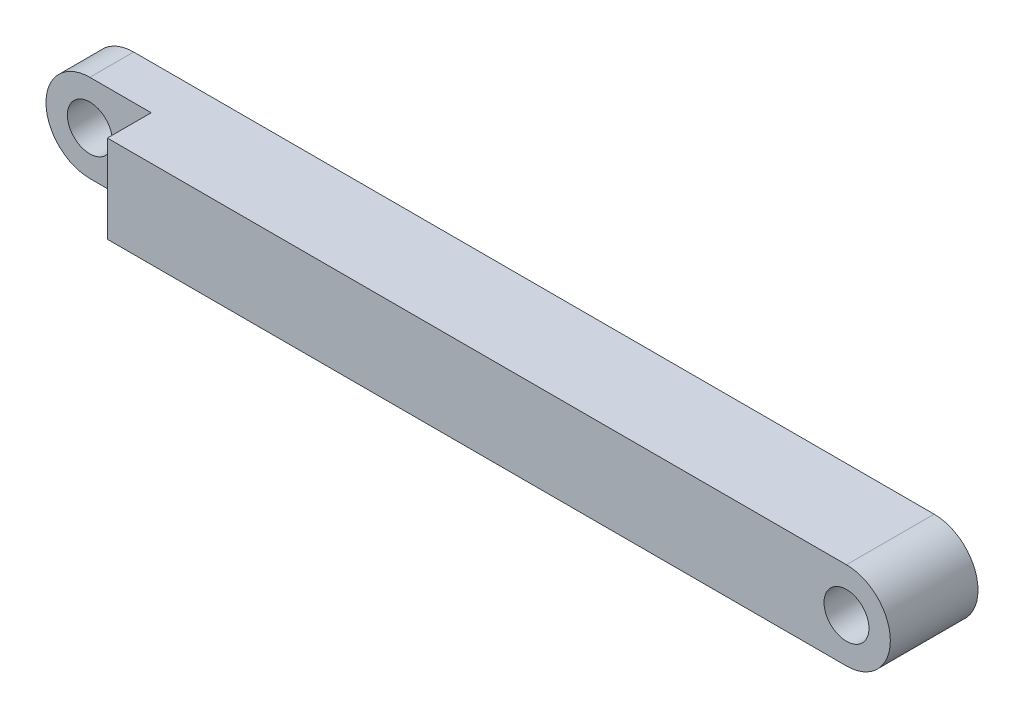
ISO-10303-21;
HEADER;
FILE_DESCRIPTION(('STEP AP214'),'2;1');
FILE_NAME('part.step','',(''),(''),'','','');
FILE_SCHEMA(('AUTOMOTIVE_DESIGN { 1 0 10303 214 1 1 1 1 }'));
ENDSEC;
DATA;
#1=APPLICATION_CONTEXT('core data for automotive mechanical design processes');
#2=APPLICATION_PROTOCOL_DEFINITION('international standard','automotive_design',2000,#1);
#3=PRODUCT_CONTEXT('',#1,'mechanical');
#4=PRODUCT('Part','Part','',(#3));
#5=PRODUCT_RELATED_PRODUCT_CATEGORY('part','',(#4));
#6=PRODUCT_DEFINITION_FORMATION('','',#4);
#7=PRODUCT_DEFINITION_CONTEXT('part definition',#1,'design');
#8=PRODUCT_DEFINITION('design','',#6,#7);
#9=PRODUCT_DEFINITION_SHAPE('','',#8);
#10=(LENGTH_UNIT() NAMED_UNIT(*) SI_UNIT(.MILLI.,.METRE.));
#11=(NAMED_UNIT(*) PLANE_ANGLE_UNIT() SI_UNIT($,.RADIAN.));
#12=(NAMED_UNIT(*) SI_UNIT($,.STERADIAN.) SOLID_ANGLE_UNIT());
#13=UNCERTAINTY_MEASURE_WITH_UNIT(LENGTH_MEASURE(1.E-05),#10,'distance_accuracy_value','');
#14=(GEOMETRIC_REPRESENTATION_CONTEXT(3) GLOBAL_UNCERTAINTY_ASSIGNED_CONTEXT((#13)) GLOBAL_UNIT_ASSIGNED_CONTEXT((#10,
#11,#12)) REPRESENTATION_CONTEXT('',''));
#15=CARTESIAN_POINT('',(0.,0.,0.));
#16=DIRECTION('',(0.,0.,1.));
#17=DIRECTION('',(1.,0.,0.));
#18=AXIS2_PLACEMENT_3D('',#15,#16,#17);
#19=CARTESIAN_POINT('',(-3.175,0.,6.35));
#20=DIRECTION('',(0.,0.,1.));
#21=DIRECTION('',(1.,0.,0.));
#22=AXIS2_PLACEMENT_3D('',#19,#20,#21);
#23=PLANE('',#22);
#24=DIRECTION('',(0.,1.,0.));
#25=VECTOR('',#24,1.);
#26=CARTESIAN_POINT('',(-56.706306570156,3.175,6.35));
#27=LINE('',#26,#25);
#28=CARTESIAN_POINT('',(-56.706306570156,-3.17500000000002,6.35));
#29=VERTEX_POINT('',#28);
#30=CARTESIAN_POINT('',(-56.706306570156,3.175,6.35));
#31=VERTEX_POINT('',#30);
#32=EDGE_CURVE('E143',#29,#31,#27,.T.);
#33=ORIENTED_EDGE('',*,*,#32,.F.);
#34=DIRECTION('',(1.,0.,0.));
#35=VECTOR('',#34,1.);
#36=CARTESIAN_POINT('',(-35.4566020445434,-3.175,6.35));
#37=LINE('',#36,#35);
#38=CARTESIAN_POINT('',(-3.175,-3.175,6.35));
#39=VERTEX_POINT('',#38);
#40=EDGE_CURVE('E109',#29,#39,#37,.T.);
#41=ORIENTED_EDGE('',*,*,#40,.T.);
#42=CARTESIAN_POINT('',(-3.175,0.,6.35));
#43=DIRECTION('',(0.,0.,1.));
#44=DIRECTION('',(1.,0.,0.));
#45=AXIS2_PLACEMENT_3D('',#42,#43,#44);
#46=CIRCLE('',#45,3.175);
#47=CARTESIAN_POINT('',(-3.175,3.175,6.35));
#48=VERTEX_POINT('',#47);
#49=EDGE_CURVE('E64',#39,#48,#46,.T.);
#50=ORIENTED_EDGE('',*,*,#49,.T.);
#51=DIRECTION('',(-1.,0.,0.));
#52=VECTOR('',#51,1.);
#53=CARTESIAN_POINT('',(-61.1513065701559,3.175,6.35));
#54=LINE('',#53,#52);
#55=EDGE_CURVE('E94',#48,#31,#54,.T.);
#56=ORIENTED_EDGE('',*,*,#55,.T.);
#57=EDGE_LOOP('',(#33,#41,#50,#56));
#58=FACE_BOUND('',#57,.T.);
#59=CARTESIAN_POINT('',(-3.175,0.,6.35));
#60=DIRECTION('',(0.,0.,1.));
#61=DIRECTION('',(1.,0.,0.));
#62=AXIS2_PLACEMENT_3D('',#59,#60,#61);
#63=CIRCLE('',#62,1.627);
#64=CARTESIAN_POINT('',(-1.548,0.,6.35));
#65=VERTEX_POINT('',#64);
#66=EDGE_CURVE('E123',#65,#65,#63,.T.);
#67=ORIENTED_EDGE('',*,*,#66,.F.);
#68=EDGE_LOOP('',(#67));
#69=FACE_BOUND('',#68,.T.);
#70=ADVANCED_FACE('F39',(#58,#69),#23,.T.);
#71=CARTESIAN_POINT('',(-3.175,0.,0.));
#72=DIRECTION('',(0.,0.,1.));
#73=DIRECTION('',(1.,0.,0.));
#74=AXIS2_PLACEMENT_3D('',#71,#72,#73);
#75=PLANE('',#74);
#76=CARTESIAN_POINT('',(-61.151306570156,0.,0.));
#77=DIRECTION('',(0.,0.,1.));
#78=DIRECTION('',(1.,0.,0.));
#79=AXIS2_PLACEMENT_3D('',#76,#77,#78);
#80=CIRCLE('',#79,3.17499999999994);
#81=CARTESIAN_POINT('',(-61.1513065701559,3.17499999999994,0.));
#82=VERTEX_POINT('',#81);
#83=CARTESIAN_POINT('',(-61.1513065701559,-3.175,0.));
#84=VERTEX_POINT('',#83);
#85=EDGE_CURVE('E90',#82,#84,#80,.T.);
#86=ORIENTED_EDGE('',*,*,#85,.F.);
#87=DIRECTION('',(-1.,0.,0.));
#88=VECTOR('',#87,1.);
#89=CARTESIAN_POINT('',(-35.4566020445434,3.175,0.));
#90=LINE('',#89,#88);
#91=CARTESIAN_POINT('',(-3.175,3.175,0.));
#92=VERTEX_POINT('',#91);
#93=EDGE_CURVE('E82',#92,#82,#90,.T.);
#94=ORIENTED_EDGE('',*,*,#93,.F.);
#95=CARTESIAN_POINT('',(-3.175,0.,0.));
#96=DIRECTION('',(0.,0.,1.));
#97=DIRECTION('',(1.,0.,0.));
#98=AXIS2_PLACEMENT_3D('',#95,#96,#97);
#99=CIRCLE('',#98,3.175);
#100=CARTESIAN_POINT('',(-3.175,-3.175,0.));
#101=VERTEX_POINT('',#100);
#102=EDGE_CURVE('E87',#101,#92,#99,.T.);
#103=ORIENTED_EDGE('',*,*,#102,.F.);
#104=DIRECTION('',(1.,0.,0.));
#105=VECTOR('',#104,1.);
#106=CARTESIAN_POINT('',(-3.175,-3.175,0.));
#107=LINE('',#106,#105);
#108=EDGE_CURVE('E103',#84,#101,#107,.T.);
#109=ORIENTED_EDGE('',*,*,#108,.F.);
#110=EDGE_LOOP('',(#86,#94,#103,#109));
#111=FACE_BOUND('',#110,.T.);
#112=CARTESIAN_POINT('',(-3.175,0.,0.));
#113=DIRECTION('',(0.,0.,1.));
#114=DIRECTION('',(1.,0.,0.));
#115=AXIS2_PLACEMENT_3D('',#112,#113,#114);
#116=CIRCLE('',#115,1.627);
#117=CARTESIAN_POINT('',(-1.548,0.,0.));
#118=VERTEX_POINT('',#117);
#119=EDGE_CURVE('E126',#118,#118,#116,.T.);
#120=ORIENTED_EDGE('',*,*,#119,.T.);
#121=EDGE_LOOP('',(#120));
#122=FACE_BOUND('',#121,.T.);
#123=CARTESIAN_POINT('',(-61.151306570156,0.,0.));
#124=DIRECTION('',(0.,0.,1.));
#125=DIRECTION('',(1.,0.,0.));
#126=AXIS2_PLACEMENT_3D('',#123,#124,#125);
#127=CIRCLE('',#126,1.62700000000004);
#128=CARTESIAN_POINT('',(-59.524306570156,0.,0.));
#129=VERTEX_POINT('',#128);
#130=EDGE_CURVE('E132',#129,#129,#127,.T.);
#131=ORIENTED_EDGE('',*,*,#130,.T.);
#132=EDGE_LOOP('',(#131));
#133=FACE_BOUND('',#132,.T.);
#134=ADVANCED_FACE('F84',(#111,#122,#133),#75,.F.);
#135=CARTESIAN_POINT('',(-61.151306570156,0.,6.35));
#136=DIRECTION('',(0.,0.,-1.));
#137=DIRECTION('',(-1.,0.,0.));
#138=AXIS2_PLACEMENT_3D('',#135,#136,#137);
#139=CYLINDRICAL_SURFACE('',#138,3.17499999999994);
#140=DIRECTION('',(0.,0.,-1.));
#141=VECTOR('',#140,1.);
#142=CARTESIAN_POINT('',(-61.1513065701559,-3.175,6.35));
#143=LINE('',#142,#141);
#144=CARTESIAN_POINT('',(-61.1513065701559,-3.17500000000002,3.175));
#145=VERTEX_POINT('',#144);
#146=EDGE_CURVE('E48',#145,#84,#143,.T.);
#147=ORIENTED_EDGE('',*,*,#146,.F.);
#148=CARTESIAN_POINT('',(-61.151306570156,0.,3.175));
#149=DIRECTION('',(0.,0.,-1.));
#150=DIRECTION('',(-1.,0.,0.));
#151=AXIS2_PLACEMENT_3D('',#148,#149,#150);
#152=CIRCLE('',#151,3.17499999999994);
#153=CARTESIAN_POINT('',(-61.1513065701559,3.17499999999997,3.175));
#154=VERTEX_POINT('',#153);
#155=EDGE_CURVE('E138',#145,#154,#152,.T.);
#156=ORIENTED_EDGE('',*,*,#155,.T.);
#157=DIRECTION('',(0.,0.,-1.));
#158=VECTOR('',#157,1.);
#159=CARTESIAN_POINT('',(-61.1513065701559,3.17499999999994,6.35));
#160=LINE('',#159,#158);
#161=EDGE_CURVE('E11',#154,#82,#160,.T.);
#162=ORIENTED_EDGE('',*,*,#161,.T.);
#163=ORIENTED_EDGE('',*,*,#85,.T.);
#164=EDGE_LOOP('',(#147,#156,#162,#163));
#165=FACE_BOUND('',#164,.T.);
#166=ADVANCED_FACE('F41',(#165),#139,.T.);
#167=CARTESIAN_POINT('',(-3.175,-3.175,6.35));
#168=DIRECTION('',(0.,1.,0.));
#169=DIRECTION('',(-1.,0.,0.));
#170=AXIS2_PLACEMENT_3D('',#167,#168,#169);
#171=PLANE('',#170);
#172=ORIENTED_EDGE('',*,*,#40,.F.);
#173=DIRECTION('',(0.,0.,-1.));
#174=VECTOR('',#173,1.);
#175=CARTESIAN_POINT('',(-56.706306570156,-3.17500000000002,6.35));
#176=LINE('',#175,#174);
#177=CARTESIAN_POINT('',(-56.706306570156,-3.17500000000002,3.175));
#178=VERTEX_POINT('',#177);
#179=EDGE_CURVE('E136',#29,#178,#176,.T.);
#180=ORIENTED_EDGE('',*,*,#179,.T.);
#181=DIRECTION('',(-1.,0.,0.));
#182=VECTOR('',#181,1.);
#183=CARTESIAN_POINT('',(-3.175,-3.175,3.175));
#184=LINE('',#183,#182);
#185=EDGE_CURVE('E119',#178,#145,#184,.T.);
#186=ORIENTED_EDGE('',*,*,#185,.T.);
#187=ORIENTED_EDGE('',*,*,#146,.T.);
#188=ORIENTED_EDGE('',*,*,#108,.T.);
#189=DIRECTION('',(0.,0.,-1.));
#190=VECTOR('',#189,1.);
#191=CARTESIAN_POINT('',(-3.175,-3.175,6.35));
#192=LINE('',#191,#190);
#193=EDGE_CURVE('E102',#39,#101,#192,.T.);
#194=ORIENTED_EDGE('',*,*,#193,.F.);
#195=EDGE_LOOP('',(#172,#180,#186,#187,#188,#194));
#196=FACE_BOUND('',#195,.T.);
#197=ADVANCED_FACE('F116',(#196),#171,.F.);
#198=CARTESIAN_POINT('',(-3.175,0.,6.35));
#199=DIRECTION('',(0.,0.,-1.));
#200=DIRECTION('',(-1.,0.,0.));
#201=AXIS2_PLACEMENT_3D('',#198,#199,#200);
#202=CYLINDRICAL_SURFACE('',#201,3.175);
#203=ORIENTED_EDGE('',*,*,#102,.T.);
#204=DIRECTION('',(0.,0.,-1.));
#205=VECTOR('',#204,1.);
#206=CARTESIAN_POINT('',(-3.175,3.175,6.35));
#207=LINE('',#206,#205);
#208=EDGE_CURVE('E100',#48,#92,#207,.T.);
#209=ORIENTED_EDGE('',*,*,#208,.F.);
#210=ORIENTED_EDGE('',*,*,#49,.F.);
#211=ORIENTED_EDGE('',*,*,#193,.T.);
#212=EDGE_LOOP('',(#203,#209,#210,#211));
#213=FACE_BOUND('',#212,.T.);
#214=ADVANCED_FACE('F99',(#213),#202,.T.);
#215=CARTESIAN_POINT('',(-35.4566020445434,3.175,6.35));
#216=DIRECTION('',(0.,-1.,0.));
#217=DIRECTION('',(0.,0.,-1.));
#218=AXIS2_PLACEMENT_3D('',#215,#216,#217);
#219=PLANE('',#218);
#220=DIRECTION('',(-1.,0.,0.));
#221=VECTOR('',#220,1.);
#222=CARTESIAN_POINT('',(-56.706306570156,3.175,3.175));
#223=LINE('',#222,#221);
#224=CARTESIAN_POINT('',(-56.706306570156,3.175,3.175));
#225=VERTEX_POINT('',#224);
#226=EDGE_CURVE('E142',#225,#154,#223,.T.);
#227=ORIENTED_EDGE('',*,*,#226,.F.);
#228=DIRECTION('',(0.,0.,1.));
#229=VECTOR('',#228,1.);
#230=CARTESIAN_POINT('',(-56.706306570156,3.175,3.175));
#231=LINE('',#230,#229);
#232=EDGE_CURVE('E55',#225,#31,#231,.T.);
#233=ORIENTED_EDGE('',*,*,#232,.T.);
#234=ORIENTED_EDGE('',*,*,#55,.F.);
#235=ORIENTED_EDGE('',*,*,#208,.T.);
#236=ORIENTED_EDGE('',*,*,#93,.T.);
#237=ORIENTED_EDGE('',*,*,#161,.F.);
#238=EDGE_LOOP('',(#227,#233,#234,#235,#236,#237));
#239=FACE_BOUND('',#238,.T.);
#240=ADVANCED_FACE('F106',(#239),#219,.F.);
#241=CARTESIAN_POINT('',(-3.175,0.,6.35));
#242=DIRECTION('',(0.,0.,-1.));
#243=DIRECTION('',(-1.,0.,0.));
#244=AXIS2_PLACEMENT_3D('',#241,#242,#243);
#245=CYLINDRICAL_SURFACE('',#244,1.627);
#246=ORIENTED_EDGE('',*,*,#66,.T.);
#247=EDGE_LOOP('',(#246));
#248=FACE_BOUND('',#247,.T.);
#249=ORIENTED_EDGE('',*,*,#119,.F.);
#250=EDGE_LOOP('',(#249));
#251=FACE_BOUND('',#250,.T.);
#252=ADVANCED_FACE('F167',(#248,#251),#245,.F.);
#253=CARTESIAN_POINT('',(-61.151306570156,0.,6.35));
#254=DIRECTION('',(0.,0.,-1.));
#255=DIRECTION('',(-1.,0.,0.));
#256=AXIS2_PLACEMENT_3D('',#253,#254,#255);
#257=CYLINDRICAL_SURFACE('',#256,1.62700000000004);
#258=CARTESIAN_POINT('',(-61.151306570156,0.,3.175));
#259=DIRECTION('',(0.,0.,-1.));
#260=DIRECTION('',(-1.,0.,0.));
#261=AXIS2_PLACEMENT_3D('',#258,#259,#260);
#262=CIRCLE('',#261,1.62700000000004);
#263=CARTESIAN_POINT('',(-62.778306570156,0.,3.175));
#264=VERTEX_POINT('',#263);
#265=EDGE_CURVE('E43',#264,#264,#262,.T.);
#266=ORIENTED_EDGE('',*,*,#265,.F.);
#267=EDGE_LOOP('',(#266));
#268=FACE_BOUND('',#267,.T.);
#269=ORIENTED_EDGE('',*,*,#130,.F.);
#270=EDGE_LOOP('',(#269));
#271=FACE_BOUND('',#270,.T.);
#272=ADVANCED_FACE('F170',(#268,#271),#257,.F.);
#273=CARTESIAN_POINT('',(-56.706306570156,3.175,3.175));
#274=DIRECTION('',(1.,0.,0.));
#275=DIRECTION('',(0.,0.,-1.));
#276=AXIS2_PLACEMENT_3D('',#273,#274,#275);
#277=PLANE('',#276);
#278=ORIENTED_EDGE('',*,*,#32,.T.);
#279=ORIENTED_EDGE('',*,*,#232,.F.);
#280=DIRECTION('',(0.,1.,0.));
#281=VECTOR('',#280,1.);
#282=CARTESIAN_POINT('',(-56.706306570156,3.175,3.175));
#283=LINE('',#282,#281);
#284=EDGE_CURVE('E145',#178,#225,#283,.T.);
#285=ORIENTED_EDGE('',*,*,#284,.F.);
#286=ORIENTED_EDGE('',*,*,#179,.F.);
#287=EDGE_LOOP('',(#278,#279,#285,#286));
#288=FACE_BOUND('',#287,.T.);
#289=ADVANCED_FACE('F161',(#288),#277,.F.);
#290=CARTESIAN_POINT('',(0.,0.,3.175));
#291=DIRECTION('',(0.,0.,-1.));
#292=DIRECTION('',(-1.,0.,0.));
#293=AXIS2_PLACEMENT_3D('',#290,#291,#292);
#294=PLANE('',#293);
#295=ORIENTED_EDGE('',*,*,#265,.T.);
#296=EDGE_LOOP('',(#295));
#297=FACE_BOUND('',#296,.T.);
#298=ORIENTED_EDGE('',*,*,#185,.F.);
#299=ORIENTED_EDGE('',*,*,#284,.T.);
#300=ORIENTED_EDGE('',*,*,#226,.T.);
#301=ORIENTED_EDGE('',*,*,#155,.F.);
#302=EDGE_LOOP('',(#298,#299,#300,#301));
#303=FACE_BOUND('',#302,.T.);
#304=ADVANCED_FACE('F149',(#297,#303),#294,.F.);
#305=CLOSED_SHELL('',(#70,#134,#166,#197,#214,#240,#252,#272,#289,#304));
#306=MANIFOLD_SOLID_BREP('B2',#305);
#307=ADVANCED_BREP_SHAPE_REPRESENTATION('',(#18,#306),#14);
#308=SHAPE_DEFINITION_REPRESENTATION(#9,#307);
ENDSEC;
END-ISO-10303-21;
